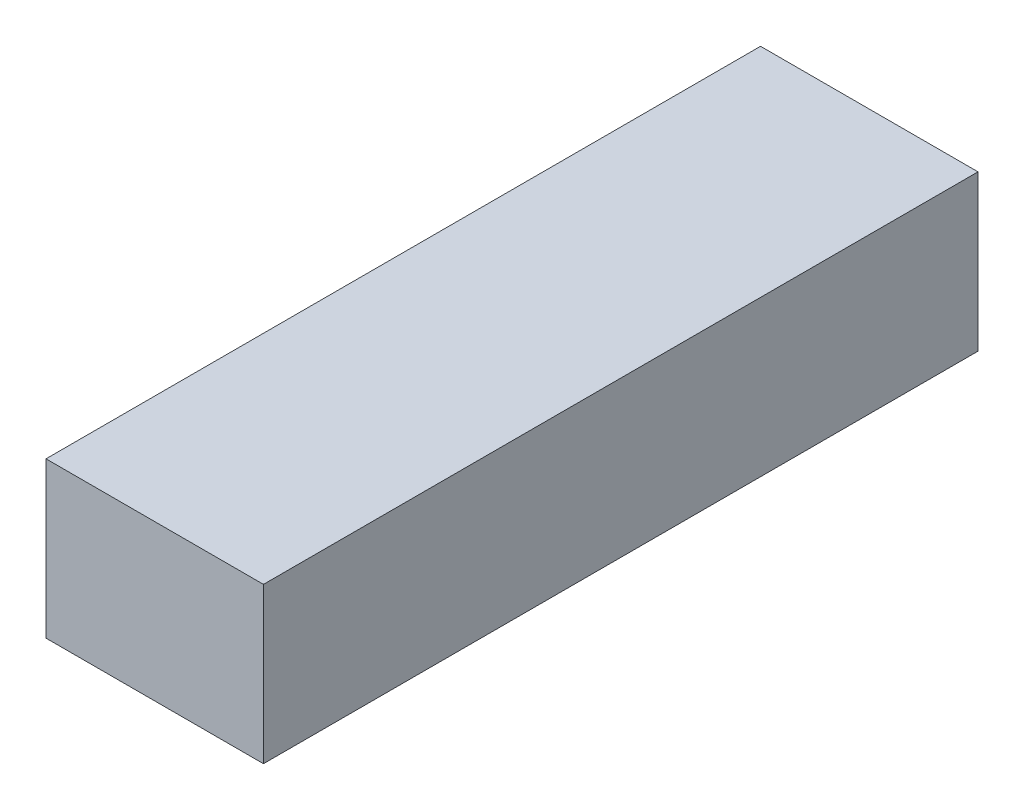
ISO-10303-21;
HEADER;
FILE_DESCRIPTION(('STEP AP214'),'2;1');
FILE_NAME('part.step','',(''),(''),'','','');
FILE_SCHEMA(('AUTOMOTIVE_DESIGN { 1 0 10303 214 1 1 1 1 }'));
ENDSEC;
DATA;
#1=APPLICATION_CONTEXT('core data for automotive mechanical design processes');
#2=APPLICATION_PROTOCOL_DEFINITION('international standard','automotive_design',2000,#1);
#3=PRODUCT_CONTEXT('',#1,'mechanical');
#4=PRODUCT('Part','Part','',(#3));
#5=PRODUCT_RELATED_PRODUCT_CATEGORY('part','',(#4));
#6=PRODUCT_DEFINITION_FORMATION('','',#4);
#7=PRODUCT_DEFINITION_CONTEXT('part definition',#1,'design');
#8=PRODUCT_DEFINITION('design','',#6,#7);
#9=PRODUCT_DEFINITION_SHAPE('','',#8);
#10=(LENGTH_UNIT() NAMED_UNIT(*) SI_UNIT(.MILLI.,.METRE.));
#11=(NAMED_UNIT(*) PLANE_ANGLE_UNIT() SI_UNIT($,.RADIAN.));
#12=(NAMED_UNIT(*) SI_UNIT($,.STERADIAN.) SOLID_ANGLE_UNIT());
#13=UNCERTAINTY_MEASURE_WITH_UNIT(LENGTH_MEASURE(1.E-05),#10,'distance_accuracy_value','');
#14=(GEOMETRIC_REPRESENTATION_CONTEXT(3) GLOBAL_UNCERTAINTY_ASSIGNED_CONTEXT((#13)) GLOBAL_UNIT_ASSIGNED_CONTEXT((#10,
#11,#12)) REPRESENTATION_CONTEXT('',''));
#15=CARTESIAN_POINT('',(0.,0.,0.));
#16=DIRECTION('',(0.,0.,1.));
#17=DIRECTION('',(1.,0.,0.));
#18=AXIS2_PLACEMENT_3D('',#15,#16,#17);
#19=CARTESIAN_POINT('',(17.5,25.,-57.5));
#20=DIRECTION('',(-1.,0.,0.));
#21=DIRECTION('',(0.,0.,1.));
#22=AXIS2_PLACEMENT_3D('',#19,#20,#21);
#23=PLANE('',#22);
#24=DIRECTION('',(0.,0.,-1.));
#25=VECTOR('',#24,1.);
#26=CARTESIAN_POINT('',(17.5,0.,-57.5));
#27=LINE('',#26,#25);
#28=CARTESIAN_POINT('',(17.5,0.,57.5));
#29=VERTEX_POINT('',#28);
#30=CARTESIAN_POINT('',(17.5,0.,-57.5));
#31=VERTEX_POINT('',#30);
#32=EDGE_CURVE('E105',#29,#31,#27,.T.);
#33=ORIENTED_EDGE('',*,*,#32,.T.);
#34=DIRECTION('',(0.,-1.,0.));
#35=VECTOR('',#34,1.);
#36=CARTESIAN_POINT('',(17.5,25.,-57.5));
#37=LINE('',#36,#35);
#38=CARTESIAN_POINT('',(17.5,25.,-57.5));
#39=VERTEX_POINT('',#38);
#40=EDGE_CURVE('E11',#39,#31,#37,.T.);
#41=ORIENTED_EDGE('',*,*,#40,.F.);
#42=DIRECTION('',(0.,0.,-1.));
#43=VECTOR('',#42,1.);
#44=CARTESIAN_POINT('',(17.5,25.,-57.5));
#45=LINE('',#44,#43);
#46=CARTESIAN_POINT('',(17.5,25.,57.5));
#47=VERTEX_POINT('',#46);
#48=EDGE_CURVE('E89',#47,#39,#45,.T.);
#49=ORIENTED_EDGE('',*,*,#48,.F.);
#50=DIRECTION('',(0.,-1.,0.));
#51=VECTOR('',#50,1.);
#52=CARTESIAN_POINT('',(17.5,25.,57.5));
#53=LINE('',#52,#51);
#54=EDGE_CURVE('E97',#47,#29,#53,.T.);
#55=ORIENTED_EDGE('',*,*,#54,.T.);
#56=EDGE_LOOP('',(#33,#41,#49,#55));
#57=FACE_BOUND('',#56,.T.);
#58=ADVANCED_FACE('F39',(#57),#23,.F.);
#59=CARTESIAN_POINT('',(-17.5,25.,-57.5));
#60=DIRECTION('',(0.,0.,1.));
#61=DIRECTION('',(1.,0.,0.));
#62=AXIS2_PLACEMENT_3D('',#59,#60,#61);
#63=PLANE('',#62);
#64=DIRECTION('',(-1.,0.,0.));
#65=VECTOR('',#64,1.);
#66=CARTESIAN_POINT('',(-17.5,0.,-57.5));
#67=LINE('',#66,#65);
#68=CARTESIAN_POINT('',(-17.5,0.,-57.5));
#69=VERTEX_POINT('',#68);
#70=EDGE_CURVE('E92',#31,#69,#67,.T.);
#71=ORIENTED_EDGE('',*,*,#70,.T.);
#72=DIRECTION('',(0.,-1.,0.));
#73=VECTOR('',#72,1.);
#74=CARTESIAN_POINT('',(-17.5,25.,-57.5));
#75=LINE('',#74,#73);
#76=CARTESIAN_POINT('',(-17.5,25.,-57.5));
#77=VERTEX_POINT('',#76);
#78=EDGE_CURVE('E50',#77,#69,#75,.T.);
#79=ORIENTED_EDGE('',*,*,#78,.F.);
#80=DIRECTION('',(-1.,0.,0.));
#81=VECTOR('',#80,1.);
#82=CARTESIAN_POINT('',(-17.5,25.,-57.5));
#83=LINE('',#82,#81);
#84=EDGE_CURVE('E82',#39,#77,#83,.T.);
#85=ORIENTED_EDGE('',*,*,#84,.F.);
#86=ORIENTED_EDGE('',*,*,#40,.T.);
#87=EDGE_LOOP('',(#71,#79,#85,#86));
#88=FACE_BOUND('',#87,.T.);
#89=ADVANCED_FACE('F93',(#88),#63,.F.);
#90=CARTESIAN_POINT('',(-17.5,25.,-57.5));
#91=DIRECTION('',(1.,0.,0.));
#92=DIRECTION('',(0.,0.,-1.));
#93=AXIS2_PLACEMENT_3D('',#90,#91,#92);
#94=PLANE('',#93);
#95=DIRECTION('',(0.,0.,1.));
#96=VECTOR('',#95,1.);
#97=CARTESIAN_POINT('',(-17.5,0.,-57.5));
#98=LINE('',#97,#96);
#99=CARTESIAN_POINT('',(-17.5,0.,57.5));
#100=VERTEX_POINT('',#99);
#101=EDGE_CURVE('E72',#69,#100,#98,.T.);
#102=ORIENTED_EDGE('',*,*,#101,.T.);
#103=DIRECTION('',(0.,-1.,0.));
#104=VECTOR('',#103,1.);
#105=CARTESIAN_POINT('',(-17.5,25.,57.5));
#106=LINE('',#105,#104);
#107=CARTESIAN_POINT('',(-17.5,25.,57.5));
#108=VERTEX_POINT('',#107);
#109=EDGE_CURVE('E94',#108,#100,#106,.T.);
#110=ORIENTED_EDGE('',*,*,#109,.F.);
#111=DIRECTION('',(0.,0.,1.));
#112=VECTOR('',#111,1.);
#113=CARTESIAN_POINT('',(-17.5,25.,-57.5));
#114=LINE('',#113,#112);
#115=EDGE_CURVE('E88',#77,#108,#114,.T.);
#116=ORIENTED_EDGE('',*,*,#115,.F.);
#117=ORIENTED_EDGE('',*,*,#78,.T.);
#118=EDGE_LOOP('',(#102,#110,#116,#117));
#119=FACE_BOUND('',#118,.T.);
#120=ADVANCED_FACE('F96',(#119),#94,.F.);
#121=CARTESIAN_POINT('',(-17.5,25.,57.5));
#122=DIRECTION('',(0.,0.,-1.));
#123=DIRECTION('',(-1.,0.,0.));
#124=AXIS2_PLACEMENT_3D('',#121,#122,#123);
#125=PLANE('',#124);
#126=DIRECTION('',(1.,0.,0.));
#127=VECTOR('',#126,1.);
#128=CARTESIAN_POINT('',(-17.5,0.,57.5));
#129=LINE('',#128,#127);
#130=EDGE_CURVE('E76',#100,#29,#129,.T.);
#131=ORIENTED_EDGE('',*,*,#130,.T.);
#132=ORIENTED_EDGE('',*,*,#54,.F.);
#133=DIRECTION('',(1.,0.,0.));
#134=VECTOR('',#133,1.);
#135=CARTESIAN_POINT('',(-17.5,25.,57.5));
#136=LINE('',#135,#134);
#137=EDGE_CURVE('E54',#108,#47,#136,.T.);
#138=ORIENTED_EDGE('',*,*,#137,.F.);
#139=ORIENTED_EDGE('',*,*,#109,.T.);
#140=EDGE_LOOP('',(#131,#132,#138,#139));
#141=FACE_BOUND('',#140,.T.);
#142=ADVANCED_FACE('F108',(#141),#125,.F.);
#143=CARTESIAN_POINT('',(0.,25.,0.));
#144=DIRECTION('',(0.,1.,0.));
#145=DIRECTION('',(0.,0.,1.));
#146=AXIS2_PLACEMENT_3D('',#143,#144,#145);
#147=PLANE('',#146);
#148=ORIENTED_EDGE('',*,*,#48,.T.);
#149=ORIENTED_EDGE('',*,*,#84,.T.);
#150=ORIENTED_EDGE('',*,*,#115,.T.);
#151=ORIENTED_EDGE('',*,*,#137,.T.);
#152=EDGE_LOOP('',(#148,#149,#150,#151));
#153=FACE_BOUND('',#152,.T.);
#154=ADVANCED_FACE('F86',(#153),#147,.T.);
#155=CARTESIAN_POINT('',(0.,0.,0.));
#156=DIRECTION('',(0.,1.,0.));
#157=DIRECTION('',(0.,0.,1.));
#158=AXIS2_PLACEMENT_3D('',#155,#156,#157);
#159=PLANE('',#158);
#160=ORIENTED_EDGE('',*,*,#32,.F.);
#161=ORIENTED_EDGE('',*,*,#130,.F.);
#162=ORIENTED_EDGE('',*,*,#101,.F.);
#163=ORIENTED_EDGE('',*,*,#70,.F.);
#164=EDGE_LOOP('',(#160,#161,#162,#163));
#165=FACE_BOUND('',#164,.T.);
#166=ADVANCED_FACE('F115',(#165),#159,.F.);
#167=CLOSED_SHELL('',(#58,#89,#120,#142,#154,#166));
#168=MANIFOLD_SOLID_BREP('B2',#167);
#169=ADVANCED_BREP_SHAPE_REPRESENTATION('',(#18,#168),#14);
#170=SHAPE_DEFINITION_REPRESENTATION(#9,#169);
ENDSEC;
END-ISO-10303-21;
